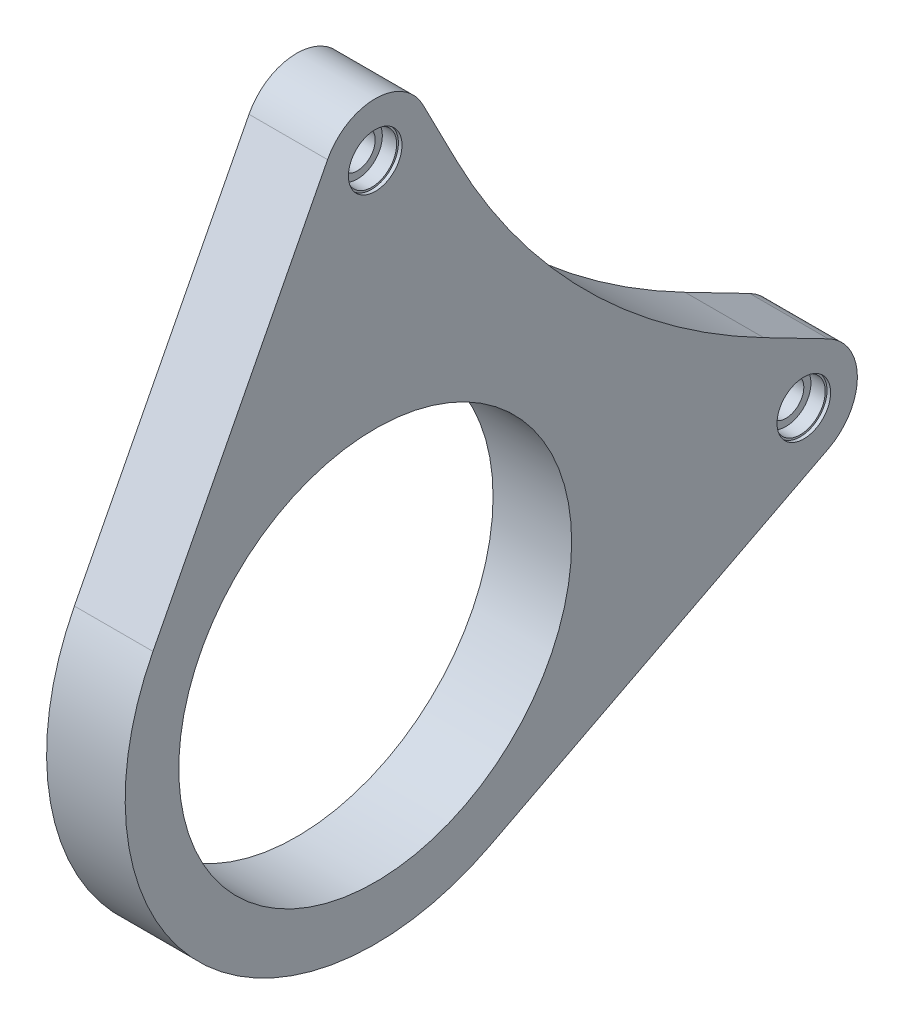
ISO-10303-21;
HEADER;
FILE_DESCRIPTION(('STEP AP214'),'2;1');
FILE_NAME('part.step','',(''),(''),'','','');
FILE_SCHEMA(('AUTOMOTIVE_DESIGN { 1 0 10303 214 1 1 1 1 }'));
ENDSEC;
DATA;
#1=APPLICATION_CONTEXT('core data for automotive mechanical design processes');
#2=APPLICATION_PROTOCOL_DEFINITION('international standard','automotive_design',2000,#1);
#3=PRODUCT_CONTEXT('',#1,'mechanical');
#4=PRODUCT('Part','Part','',(#3));
#5=PRODUCT_RELATED_PRODUCT_CATEGORY('part','',(#4));
#6=PRODUCT_DEFINITION_FORMATION('','',#4);
#7=PRODUCT_DEFINITION_CONTEXT('part definition',#1,'design');
#8=PRODUCT_DEFINITION('design','',#6,#7);
#9=PRODUCT_DEFINITION_SHAPE('','',#8);
#10=(LENGTH_UNIT() NAMED_UNIT(*) SI_UNIT(.MILLI.,.METRE.));
#11=(NAMED_UNIT(*) PLANE_ANGLE_UNIT() SI_UNIT($,.RADIAN.));
#12=(NAMED_UNIT(*) SI_UNIT($,.STERADIAN.) SOLID_ANGLE_UNIT());
#13=UNCERTAINTY_MEASURE_WITH_UNIT(LENGTH_MEASURE(1.E-05),#10,'distance_accuracy_value','');
#14=(GEOMETRIC_REPRESENTATION_CONTEXT(3) GLOBAL_UNCERTAINTY_ASSIGNED_CONTEXT((#13)) GLOBAL_UNIT_ASSIGNED_CONTEXT((#10,
#11,#12)) REPRESENTATION_CONTEXT('',''));
#15=CARTESIAN_POINT('',(0.,0.,0.));
#16=DIRECTION('',(0.,0.,1.));
#17=DIRECTION('',(1.,0.,0.));
#18=AXIS2_PLACEMENT_3D('',#15,#16,#17);
#19=CARTESIAN_POINT('',(11.,-3.46944695195361E-13,-120.));
#20=DIRECTION('',(-1.,0.,0.));
#21=DIRECTION('',(0.,0.,1.));
#22=AXIS2_PLACEMENT_3D('',#19,#20,#21);
#23=CYLINDRICAL_SURFACE('',#22,5.);
#24=CARTESIAN_POINT('',(6.,-3.46944695195361E-13,-120.));
#25=DIRECTION('',(1.,0.,0.));
#26=DIRECTION('',(0.,0.,-1.));
#27=AXIS2_PLACEMENT_3D('',#24,#25,#26);
#28=CIRCLE('',#27,5.);
#29=CARTESIAN_POINT('',(6.,-3.46944695195361E-13,-125.));
#30=VERTEX_POINT('',#29);
#31=EDGE_CURVE('E162',#30,#30,#28,.T.);
#32=ORIENTED_EDGE('',*,*,#31,.T.);
#33=EDGE_LOOP('',(#32));
#34=FACE_BOUND('',#33,.T.);
#35=CARTESIAN_POINT('',(-6.,-3.46944695195361E-13,-120.));
#36=DIRECTION('',(-1.,0.,0.));
#37=DIRECTION('',(0.,0.,1.));
#38=AXIS2_PLACEMENT_3D('',#35,#36,#37);
#39=CIRCLE('',#38,5.);
#40=CARTESIAN_POINT('',(-6.,-3.46944695195361E-13,-115.));
#41=VERTEX_POINT('',#40);
#42=EDGE_CURVE('E168',#41,#41,#39,.T.);
#43=ORIENTED_EDGE('',*,*,#42,.T.);
#44=EDGE_LOOP('',(#43));
#45=FACE_BOUND('',#44,.T.);
#46=ADVANCED_FACE('F45',(#34,#45),#23,.F.);
#47=CARTESIAN_POINT('',(11.,120.,0.));
#48=DIRECTION('',(-1.,0.,0.));
#49=DIRECTION('',(0.,0.,1.));
#50=AXIS2_PLACEMENT_3D('',#47,#48,#49);
#51=CYLINDRICAL_SURFACE('',#50,5.);
#52=CARTESIAN_POINT('',(6.,120.,0.));
#53=DIRECTION('',(1.,0.,0.));
#54=DIRECTION('',(0.,0.,-1.));
#55=AXIS2_PLACEMENT_3D('',#52,#53,#54);
#56=CIRCLE('',#55,5.);
#57=CARTESIAN_POINT('',(6.,120.,-5.));
#58=VERTEX_POINT('',#57);
#59=EDGE_CURVE('E150',#58,#58,#56,.T.);
#60=ORIENTED_EDGE('',*,*,#59,.T.);
#61=EDGE_LOOP('',(#60));
#62=FACE_BOUND('',#61,.T.);
#63=CARTESIAN_POINT('',(-6.,120.,0.));
#64=DIRECTION('',(-1.,0.,0.));
#65=DIRECTION('',(0.,0.,1.));
#66=AXIS2_PLACEMENT_3D('',#63,#64,#65);
#67=CIRCLE('',#66,5.);
#68=CARTESIAN_POINT('',(-6.,120.,5.));
#69=VERTEX_POINT('',#68);
#70=EDGE_CURVE('E156',#69,#69,#67,.T.);
#71=ORIENTED_EDGE('',*,*,#70,.T.);
#72=EDGE_LOOP('',(#71));
#73=FACE_BOUND('',#72,.T.);
#74=ADVANCED_FACE('F324',(#62,#73),#51,.F.);
#75=CARTESIAN_POINT('',(11.,0.,0.));
#76=DIRECTION('',(1.,0.,0.));
#77=DIRECTION('',(0.,0.,-1.));
#78=AXIS2_PLACEMENT_3D('',#75,#76,#77);
#79=PLANE('',#78);
#80=CARTESIAN_POINT('',(11.,-3.99680288865056E-13,-120.));
#81=DIRECTION('',(-1.,0.,0.));
#82=DIRECTION('',(0.,1.,0.));
#83=AXIS2_PLACEMENT_3D('',#80,#81,#82);
#84=CIRCLE('',#83,7.5);
#85=CARTESIAN_POINT('',(11.,7.4999999999996,-120.));
#86=VERTEX_POINT('',#85);
#87=EDGE_CURVE('E204',#86,#86,#84,.T.);
#88=ORIENTED_EDGE('',*,*,#87,.T.);
#89=EDGE_LOOP('',(#88));
#90=FACE_BOUND('',#89,.T.);
#91=CARTESIAN_POINT('',(11.,120.,0.));
#92=DIRECTION('',(1.,0.,0.));
#93=DIRECTION('',(0.,0.,-1.));
#94=AXIS2_PLACEMENT_3D('',#91,#92,#93);
#95=CIRCLE('',#94,7.5);
#96=CARTESIAN_POINT('',(11.,120.,-7.5));
#97=VERTEX_POINT('',#96);
#98=EDGE_CURVE('E154',#97,#97,#95,.T.);
#99=ORIENTED_EDGE('',*,*,#98,.F.);
#100=EDGE_LOOP('',(#99));
#101=FACE_BOUND('',#100,.T.);
#102=CARTESIAN_POINT('',(11.,0.,0.));
#103=DIRECTION('',(1.,0.,0.));
#104=DIRECTION('',(0.,0.,-1.));
#105=AXIS2_PLACEMENT_3D('',#102,#103,#104);
#106=CIRCLE('',#105,70.);
#107=CARTESIAN_POINT('',(11.,32.0833333333333,62.2146262724628));
#108=VERTEX_POINT('',#107);
#109=CARTESIAN_POINT('',(11.,-62.2146262724629,-32.0833333333331));
#110=VERTEX_POINT('',#109);
#111=EDGE_CURVE('E123',#108,#110,#106,.T.);
#112=ORIENTED_EDGE('',*,*,#111,.T.);
#113=DIRECTION('',(0.,0.458333333333331,-0.888780375320899));
#114=VECTOR('',#113,1.);
#115=CARTESIAN_POINT('',(11.,-62.2146262724629,-32.0833333333331));
#116=LINE('',#115,#114);
#117=CARTESIAN_POINT('',(11.,-13.3317056298138,-126.875));
#118=VERTEX_POINT('',#117);
#119=EDGE_CURVE('E111',#110,#118,#116,.T.);
#120=ORIENTED_EDGE('',*,*,#119,.T.);
#121=CARTESIAN_POINT('',(11.,-3.46944695195361E-13,-120.));
#122=DIRECTION('',(1.,0.,0.));
#123=DIRECTION('',(0.,0.,1.));
#124=AXIS2_PLACEMENT_3D('',#121,#122,#123);
#125=CIRCLE('',#124,15.);
#126=CARTESIAN_POINT('',(11.,13.3317056298131,-126.875));
#127=VERTEX_POINT('',#126);
#128=EDGE_CURVE('E122',#118,#127,#125,.T.);
#129=ORIENTED_EDGE('',*,*,#128,.T.);
#130=DIRECTION('',(0.,0.458333333333336,0.888780375320896));
#131=VECTOR('',#130,1.);
#132=CARTESIAN_POINT('',(11.,13.3317056298131,-126.875));
#133=LINE('',#132,#131);
#134=CARTESIAN_POINT('',(11.,22.6724398157784,-108.761848213291));
#135=VERTEX_POINT('',#134);
#136=EDGE_CURVE('E247',#127,#135,#133,.T.);
#137=ORIENTED_EDGE('',*,*,#136,.T.);
#138=CARTESIAN_POINT('',(11.,200.428514879958,-200.428514879958));
#139=DIRECTION('',(1.,0.,0.));
#140=DIRECTION('',(0.,0.,-1.));
#141=AXIS2_PLACEMENT_3D('',#138,#139,#140);
#142=CIRCLE('',#141,200.);
#143=CARTESIAN_POINT('',(11.,108.761848213291,-22.6724398157787));
#144=VERTEX_POINT('',#143);
#145=EDGE_CURVE('E11',#135,#144,#142,.F.);
#146=ORIENTED_EDGE('',*,*,#145,.T.);
#147=DIRECTION('',(0.,0.888780375320898,0.458333333333333));
#148=VECTOR('',#147,1.);
#149=CARTESIAN_POINT('',(11.,126.875,-13.3317056298135));
#150=LINE('',#149,#148);
#151=CARTESIAN_POINT('',(11.,126.875,-13.3317056298135));
#152=VERTEX_POINT('',#151);
#153=EDGE_CURVE('E250',#144,#152,#150,.T.);
#154=ORIENTED_EDGE('',*,*,#153,.T.);
#155=CARTESIAN_POINT('',(11.,120.,0.));
#156=DIRECTION('',(1.,0.,0.));
#157=DIRECTION('',(0.,0.,-1.));
#158=AXIS2_PLACEMENT_3D('',#155,#156,#157);
#159=CIRCLE('',#158,15.);
#160=CARTESIAN_POINT('',(11.,126.875,13.3317056298135));
#161=VERTEX_POINT('',#160);
#162=EDGE_CURVE('E253',#152,#161,#159,.T.);
#163=ORIENTED_EDGE('',*,*,#162,.T.);
#164=DIRECTION('',(0.,-0.888780375320897,0.458333333333333));
#165=VECTOR('',#164,1.);
#166=CARTESIAN_POINT('',(11.,32.0833333333333,62.2146262724628));
#167=LINE('',#166,#165);
#168=EDGE_CURVE('E129',#161,#108,#167,.T.);
#169=ORIENTED_EDGE('',*,*,#168,.T.);
#170=EDGE_LOOP('',(#112,#120,#129,#137,#146,#154,#163,#169));
#171=FACE_BOUND('',#170,.T.);
#172=CARTESIAN_POINT('',(11.,0.,0.));
#173=DIRECTION('',(1.,0.,0.));
#174=DIRECTION('',(0.,0.,-1.));
#175=AXIS2_PLACEMENT_3D('',#172,#173,#174);
#176=CIRCLE('',#175,55.);
#177=CARTESIAN_POINT('',(11.,0.,-55.));
#178=VERTEX_POINT('',#177);
#179=EDGE_CURVE('E238',#178,#178,#176,.T.);
#180=ORIENTED_EDGE('',*,*,#179,.F.);
#181=EDGE_LOOP('',(#180));
#182=FACE_BOUND('',#181,.T.);
#183=ADVANCED_FACE('F126',(#90,#101,#171,#182),#79,.T.);
#184=CARTESIAN_POINT('',(-11.,0.,0.));
#185=DIRECTION('',(1.,0.,0.));
#186=DIRECTION('',(0.,0.,-1.));
#187=AXIS2_PLACEMENT_3D('',#184,#185,#186);
#188=PLANE('',#187);
#189=CARTESIAN_POINT('',(-11.,-3.99680288865056E-13,-120.));
#190=DIRECTION('',(-1.,0.,0.));
#191=DIRECTION('',(0.,1.,0.));
#192=AXIS2_PLACEMENT_3D('',#189,#190,#191);
#193=CIRCLE('',#192,7.5);
#194=CARTESIAN_POINT('',(-11.,7.4999999999996,-120.));
#195=VERTEX_POINT('',#194);
#196=EDGE_CURVE('E160',#195,#195,#193,.T.);
#197=ORIENTED_EDGE('',*,*,#196,.F.);
#198=EDGE_LOOP('',(#197));
#199=FACE_BOUND('',#198,.T.);
#200=CARTESIAN_POINT('',(-11.,120.,0.));
#201=DIRECTION('',(1.,0.,0.));
#202=DIRECTION('',(0.,0.,-1.));
#203=AXIS2_PLACEMENT_3D('',#200,#201,#202);
#204=CIRCLE('',#203,7.5);
#205=CARTESIAN_POINT('',(-11.,120.,-7.5));
#206=VERTEX_POINT('',#205);
#207=EDGE_CURVE('E212',#206,#206,#204,.T.);
#208=ORIENTED_EDGE('',*,*,#207,.T.);
#209=EDGE_LOOP('',(#208));
#210=FACE_BOUND('',#209,.T.);
#211=CARTESIAN_POINT('',(-11.,0.,0.));
#212=DIRECTION('',(1.,0.,0.));
#213=DIRECTION('',(0.,0.,-1.));
#214=AXIS2_PLACEMENT_3D('',#211,#212,#213);
#215=CIRCLE('',#214,70.);
#216=CARTESIAN_POINT('',(-11.,32.0833333333333,62.2146262724628));
#217=VERTEX_POINT('',#216);
#218=CARTESIAN_POINT('',(-11.,-62.2146262724629,-32.0833333333331));
#219=VERTEX_POINT('',#218);
#220=EDGE_CURVE('E138',#217,#219,#215,.T.);
#221=ORIENTED_EDGE('',*,*,#220,.F.);
#222=DIRECTION('',(0.,-0.888780375320897,0.458333333333333));
#223=VECTOR('',#222,1.);
#224=CARTESIAN_POINT('',(-11.,32.0833333333333,62.2146262724628));
#225=LINE('',#224,#223);
#226=CARTESIAN_POINT('',(-11.,126.875,13.3317056298135));
#227=VERTEX_POINT('',#226);
#228=EDGE_CURVE('E134',#227,#217,#225,.T.);
#229=ORIENTED_EDGE('',*,*,#228,.F.);
#230=CARTESIAN_POINT('',(-11.,120.,0.));
#231=DIRECTION('',(1.,0.,0.));
#232=DIRECTION('',(0.,0.,-1.));
#233=AXIS2_PLACEMENT_3D('',#230,#231,#232);
#234=CIRCLE('',#233,15.);
#235=CARTESIAN_POINT('',(-11.,126.875,-13.3317056298135));
#236=VERTEX_POINT('',#235);
#237=EDGE_CURVE('E273',#236,#227,#234,.T.);
#238=ORIENTED_EDGE('',*,*,#237,.F.);
#239=DIRECTION('',(0.,0.888780375320898,0.458333333333333));
#240=VECTOR('',#239,1.);
#241=CARTESIAN_POINT('',(-11.,126.875,-13.3317056298135));
#242=LINE('',#241,#240);
#243=CARTESIAN_POINT('',(-11.,108.761848213291,-22.6724398157787));
#244=VERTEX_POINT('',#243);
#245=EDGE_CURVE('E270',#244,#236,#242,.T.);
#246=ORIENTED_EDGE('',*,*,#245,.F.);
#247=CARTESIAN_POINT('',(-11.,200.428514879958,-200.428514879958));
#248=DIRECTION('',(1.,0.,0.));
#249=DIRECTION('',(0.,0.,-1.));
#250=AXIS2_PLACEMENT_3D('',#247,#248,#249);
#251=CIRCLE('',#250,200.);
#252=CARTESIAN_POINT('',(-11.,22.6724398157784,-108.761848213291));
#253=VERTEX_POINT('',#252);
#254=EDGE_CURVE('E54',#244,#253,#251,.T.);
#255=ORIENTED_EDGE('',*,*,#254,.T.);
#256=DIRECTION('',(0.,0.458333333333336,0.888780375320896));
#257=VECTOR('',#256,1.);
#258=CARTESIAN_POINT('',(-11.,13.3317056298131,-126.875));
#259=LINE('',#258,#257);
#260=CARTESIAN_POINT('',(-11.,13.3317056298131,-126.875));
#261=VERTEX_POINT('',#260);
#262=EDGE_CURVE('E267',#261,#253,#259,.T.);
#263=ORIENTED_EDGE('',*,*,#262,.F.);
#264=CARTESIAN_POINT('',(-11.,-3.46944695195361E-13,-120.));
#265=DIRECTION('',(1.,0.,0.));
#266=DIRECTION('',(0.,0.,1.));
#267=AXIS2_PLACEMENT_3D('',#264,#265,#266);
#268=CIRCLE('',#267,15.);
#269=CARTESIAN_POINT('',(-11.,-13.3317056298138,-126.875));
#270=VERTEX_POINT('',#269);
#271=EDGE_CURVE('E264',#270,#261,#268,.T.);
#272=ORIENTED_EDGE('',*,*,#271,.F.);
#273=DIRECTION('',(0.,0.458333333333331,-0.888780375320899));
#274=VECTOR('',#273,1.);
#275=CARTESIAN_POINT('',(-11.,-62.2146262724629,-32.0833333333331));
#276=LINE('',#275,#274);
#277=EDGE_CURVE('E261',#219,#270,#276,.T.);
#278=ORIENTED_EDGE('',*,*,#277,.F.);
#279=EDGE_LOOP('',(#221,#229,#238,#246,#255,#263,#272,#278));
#280=FACE_BOUND('',#279,.T.);
#281=CARTESIAN_POINT('',(-11.,0.,0.));
#282=DIRECTION('',(1.,0.,0.));
#283=DIRECTION('',(0.,0.,-1.));
#284=AXIS2_PLACEMENT_3D('',#281,#282,#283);
#285=CIRCLE('',#284,55.);
#286=CARTESIAN_POINT('',(-11.,0.,-55.));
#287=VERTEX_POINT('',#286);
#288=EDGE_CURVE('E234',#287,#287,#285,.T.);
#289=ORIENTED_EDGE('',*,*,#288,.T.);
#290=EDGE_LOOP('',(#289));
#291=FACE_BOUND('',#290,.T.);
#292=ADVANCED_FACE('F293',(#199,#210,#280,#291),#188,.F.);
#293=CARTESIAN_POINT('',(11.,0.,0.));
#294=DIRECTION('',(-1.,0.,0.));
#295=DIRECTION('',(0.,0.,1.));
#296=AXIS2_PLACEMENT_3D('',#293,#294,#295);
#297=CYLINDRICAL_SURFACE('',#296,70.);
#298=ORIENTED_EDGE('',*,*,#220,.T.);
#299=DIRECTION('',(-1.,0.,0.));
#300=VECTOR('',#299,1.);
#301=CARTESIAN_POINT('',(11.,-62.2146262724629,-32.0833333333331));
#302=LINE('',#301,#300);
#303=EDGE_CURVE('E115',#110,#219,#302,.T.);
#304=ORIENTED_EDGE('',*,*,#303,.F.);
#305=ORIENTED_EDGE('',*,*,#111,.F.);
#306=DIRECTION('',(-1.,0.,0.));
#307=VECTOR('',#306,1.);
#308=CARTESIAN_POINT('',(11.,32.0833333333333,62.2146262724628));
#309=LINE('',#308,#307);
#310=EDGE_CURVE('E258',#108,#217,#309,.T.);
#311=ORIENTED_EDGE('',*,*,#310,.T.);
#312=EDGE_LOOP('',(#298,#304,#305,#311));
#313=FACE_BOUND('',#312,.T.);
#314=ADVANCED_FACE('F136',(#313),#297,.T.);
#315=CARTESIAN_POINT('',(11.,-62.2146262724629,-32.0833333333331));
#316=DIRECTION('',(0.,0.888780375320899,0.458333333333331));
#317=DIRECTION('',(0.,-0.458333333333331,0.888780375320899));
#318=AXIS2_PLACEMENT_3D('',#315,#316,#317);
#319=PLANE('',#318);
#320=ORIENTED_EDGE('',*,*,#277,.T.);
#321=DIRECTION('',(-1.,0.,0.));
#322=VECTOR('',#321,1.);
#323=CARTESIAN_POINT('',(11.,-13.3317056298138,-126.875));
#324=LINE('',#323,#322);
#325=EDGE_CURVE('E118',#118,#270,#324,.T.);
#326=ORIENTED_EDGE('',*,*,#325,.F.);
#327=ORIENTED_EDGE('',*,*,#119,.F.);
#328=ORIENTED_EDGE('',*,*,#303,.T.);
#329=EDGE_LOOP('',(#320,#326,#327,#328));
#330=FACE_BOUND('',#329,.T.);
#331=ADVANCED_FACE('F113',(#330),#319,.F.);
#332=CARTESIAN_POINT('',(11.,-3.46944695195361E-13,-120.));
#333=DIRECTION('',(-1.,0.,0.));
#334=DIRECTION('',(0.,0.,1.));
#335=AXIS2_PLACEMENT_3D('',#332,#333,#334);
#336=CYLINDRICAL_SURFACE('',#335,15.);
#337=ORIENTED_EDGE('',*,*,#271,.T.);
#338=DIRECTION('',(-1.,0.,0.));
#339=VECTOR('',#338,1.);
#340=CARTESIAN_POINT('',(11.,13.3317056298131,-126.875));
#341=LINE('',#340,#339);
#342=EDGE_CURVE('E146',#127,#261,#341,.T.);
#343=ORIENTED_EDGE('',*,*,#342,.F.);
#344=ORIENTED_EDGE('',*,*,#128,.F.);
#345=ORIENTED_EDGE('',*,*,#325,.T.);
#346=EDGE_LOOP('',(#337,#343,#344,#345));
#347=FACE_BOUND('',#346,.T.);
#348=ADVANCED_FACE('F295',(#347),#336,.T.);
#349=CARTESIAN_POINT('',(11.,13.3317056298131,-126.875));
#350=DIRECTION('',(0.,-0.888780375320896,0.458333333333336));
#351=DIRECTION('',(0.,-0.458333333333336,-0.888780375320896));
#352=AXIS2_PLACEMENT_3D('',#349,#350,#351);
#353=PLANE('',#352);
#354=ORIENTED_EDGE('',*,*,#262,.T.);
#355=DIRECTION('',(-1.,0.,0.));
#356=VECTOR('',#355,1.);
#357=CARTESIAN_POINT('',(11.,22.6724398157784,-108.761848213291));
#358=LINE('',#357,#356);
#359=EDGE_CURVE('E61',#253,#135,#358,.F.);
#360=ORIENTED_EDGE('',*,*,#359,.T.);
#361=ORIENTED_EDGE('',*,*,#136,.F.);
#362=ORIENTED_EDGE('',*,*,#342,.T.);
#363=EDGE_LOOP('',(#354,#360,#361,#362));
#364=FACE_BOUND('',#363,.T.);
#365=ADVANCED_FACE('F290',(#364),#353,.F.);
#366=CARTESIAN_POINT('',(11.,126.875,-13.3317056298135));
#367=DIRECTION('',(0.,-0.458333333333333,0.888780375320898));
#368=DIRECTION('',(0.,-0.888780375320898,-0.458333333333333));
#369=AXIS2_PLACEMENT_3D('',#366,#367,#368);
#370=PLANE('',#369);
#371=ORIENTED_EDGE('',*,*,#153,.F.);
#372=DIRECTION('',(-1.,0.,0.));
#373=VECTOR('',#372,1.);
#374=CARTESIAN_POINT('',(-11.,108.761848213291,-22.6724398157787));
#375=LINE('',#374,#373);
#376=EDGE_CURVE('E140',#144,#244,#375,.T.);
#377=ORIENTED_EDGE('',*,*,#376,.T.);
#378=ORIENTED_EDGE('',*,*,#245,.T.);
#379=DIRECTION('',(-1.,0.,0.));
#380=VECTOR('',#379,1.);
#381=CARTESIAN_POINT('',(11.,126.875,-13.3317056298135));
#382=LINE('',#381,#380);
#383=EDGE_CURVE('E284',#152,#236,#382,.T.);
#384=ORIENTED_EDGE('',*,*,#383,.F.);
#385=EDGE_LOOP('',(#371,#377,#378,#384));
#386=FACE_BOUND('',#385,.T.);
#387=ADVANCED_FACE('F301',(#386),#370,.F.);
#388=CARTESIAN_POINT('',(11.,120.,0.));
#389=DIRECTION('',(-1.,0.,0.));
#390=DIRECTION('',(0.,0.,1.));
#391=AXIS2_PLACEMENT_3D('',#388,#389,#390);
#392=CYLINDRICAL_SURFACE('',#391,15.);
#393=ORIENTED_EDGE('',*,*,#237,.T.);
#394=DIRECTION('',(-1.,0.,0.));
#395=VECTOR('',#394,1.);
#396=CARTESIAN_POINT('',(11.,126.875,13.3317056298135));
#397=LINE('',#396,#395);
#398=EDGE_CURVE('E280',#161,#227,#397,.T.);
#399=ORIENTED_EDGE('',*,*,#398,.F.);
#400=ORIENTED_EDGE('',*,*,#162,.F.);
#401=ORIENTED_EDGE('',*,*,#383,.T.);
#402=EDGE_LOOP('',(#393,#399,#400,#401));
#403=FACE_BOUND('',#402,.T.);
#404=ADVANCED_FACE('F307',(#403),#392,.T.);
#405=CARTESIAN_POINT('',(11.,32.0833333333333,62.2146262724628));
#406=DIRECTION('',(0.,-0.458333333333334,-0.888780375320898));
#407=DIRECTION('',(0.,0.888780375320898,-0.458333333333334));
#408=AXIS2_PLACEMENT_3D('',#405,#406,#407);
#409=PLANE('',#408);
#410=ORIENTED_EDGE('',*,*,#228,.T.);
#411=ORIENTED_EDGE('',*,*,#310,.F.);
#412=ORIENTED_EDGE('',*,*,#168,.F.);
#413=ORIENTED_EDGE('',*,*,#398,.T.);
#414=EDGE_LOOP('',(#410,#411,#412,#413));
#415=FACE_BOUND('',#414,.T.);
#416=ADVANCED_FACE('F310',(#415),#409,.F.);
#417=CARTESIAN_POINT('',(11.,0.,0.));
#418=DIRECTION('',(-1.,0.,0.));
#419=DIRECTION('',(0.,0.,1.));
#420=AXIS2_PLACEMENT_3D('',#417,#418,#419);
#421=CYLINDRICAL_SURFACE('',#420,55.);
#422=ORIENTED_EDGE('',*,*,#179,.T.);
#423=EDGE_LOOP('',(#422));
#424=FACE_BOUND('',#423,.T.);
#425=ORIENTED_EDGE('',*,*,#288,.F.);
#426=EDGE_LOOP('',(#425));
#427=FACE_BOUND('',#426,.T.);
#428=ADVANCED_FACE('F312',(#424,#427),#421,.F.);
#429=CARTESIAN_POINT('',(10.,120.,0.));
#430=DIRECTION('',(1.,0.,0.));
#431=DIRECTION('',(0.,0.,-1.));
#432=AXIS2_PLACEMENT_3D('',#429,#430,#431);
#433=CYLINDRICAL_SURFACE('',#432,7.5);
#434=CARTESIAN_POINT('',(10.,120.,0.));
#435=DIRECTION('',(1.,0.,0.));
#436=DIRECTION('',(0.,0.,-1.));
#437=AXIS2_PLACEMENT_3D('',#434,#435,#436);
#438=CIRCLE('',#437,7.5);
#439=CARTESIAN_POINT('',(10.,120.,-7.5));
#440=VERTEX_POINT('',#439);
#441=EDGE_CURVE('E230',#440,#440,#438,.T.);
#442=ORIENTED_EDGE('',*,*,#441,.F.);
#443=EDGE_LOOP('',(#442));
#444=FACE_BOUND('',#443,.T.);
#445=ORIENTED_EDGE('',*,*,#98,.T.);
#446=EDGE_LOOP('',(#445));
#447=FACE_BOUND('',#446,.T.);
#448=ADVANCED_FACE('F318',(#444,#447),#433,.F.);
#449=CARTESIAN_POINT('',(10.,120.,0.));
#450=DIRECTION('',(1.,0.,0.));
#451=DIRECTION('',(0.,0.,-1.));
#452=AXIS2_PLACEMENT_3D('',#449,#450,#451);
#453=PLANE('',#452);
#454=CARTESIAN_POINT('',(10.,120.,0.));
#455=DIRECTION('',(1.,0.,0.));
#456=DIRECTION('',(0.,0.,-1.));
#457=AXIS2_PLACEMENT_3D('',#454,#455,#456);
#458=CIRCLE('',#457,7.);
#459=CARTESIAN_POINT('',(10.,120.,-7.));
#460=VERTEX_POINT('',#459);
#461=EDGE_CURVE('E220',#460,#460,#458,.T.);
#462=ORIENTED_EDGE('',*,*,#461,.F.);
#463=EDGE_LOOP('',(#462));
#464=FACE_BOUND('',#463,.T.);
#465=ORIENTED_EDGE('',*,*,#441,.T.);
#466=EDGE_LOOP('',(#465));
#467=FACE_BOUND('',#466,.T.);
#468=ADVANCED_FACE('F366',(#464,#467),#453,.T.);
#469=CARTESIAN_POINT('',(6.,120.,0.));
#470=DIRECTION('',(1.,0.,0.));
#471=DIRECTION('',(0.,0.,-1.));
#472=AXIS2_PLACEMENT_3D('',#469,#470,#471);
#473=CYLINDRICAL_SURFACE('',#472,7.);
#474=CARTESIAN_POINT('',(6.,120.,0.));
#475=DIRECTION('',(1.,0.,0.));
#476=DIRECTION('',(0.,0.,-1.));
#477=AXIS2_PLACEMENT_3D('',#474,#475,#476);
#478=CIRCLE('',#477,7.);
#479=CARTESIAN_POINT('',(6.,120.,-7.));
#480=VERTEX_POINT('',#479);
#481=EDGE_CURVE('E155',#480,#480,#478,.T.);
#482=ORIENTED_EDGE('',*,*,#481,.F.);
#483=EDGE_LOOP('',(#482));
#484=FACE_BOUND('',#483,.T.);
#485=ORIENTED_EDGE('',*,*,#461,.T.);
#486=EDGE_LOOP('',(#485));
#487=FACE_BOUND('',#486,.T.);
#488=ADVANCED_FACE('F360',(#484,#487),#473,.F.);
#489=CARTESIAN_POINT('',(6.,120.,0.));
#490=DIRECTION('',(1.,0.,0.));
#491=DIRECTION('',(0.,0.,-1.));
#492=AXIS2_PLACEMENT_3D('',#489,#490,#491);
#493=PLANE('',#492);
#494=ORIENTED_EDGE('',*,*,#59,.F.);
#495=EDGE_LOOP('',(#494));
#496=FACE_BOUND('',#495,.T.);
#497=ORIENTED_EDGE('',*,*,#481,.T.);
#498=EDGE_LOOP('',(#497));
#499=FACE_BOUND('',#498,.T.);
#500=ADVANCED_FACE('F351',(#496,#499),#493,.T.);
#501=CARTESIAN_POINT('',(-10.,120.,0.));
#502=DIRECTION('',(-1.,0.,0.));
#503=DIRECTION('',(0.,0.,1.));
#504=AXIS2_PLACEMENT_3D('',#501,#502,#503);
#505=CYLINDRICAL_SURFACE('',#504,7.5);
#506=CARTESIAN_POINT('',(-10.,120.,0.));
#507=DIRECTION('',(1.,0.,0.));
#508=DIRECTION('',(0.,0.,-1.));
#509=AXIS2_PLACEMENT_3D('',#506,#507,#508);
#510=CIRCLE('',#509,7.5);
#511=CARTESIAN_POINT('',(-10.,120.,-7.5));
#512=VERTEX_POINT('',#511);
#513=EDGE_CURVE('E216',#512,#512,#510,.T.);
#514=ORIENTED_EDGE('',*,*,#513,.T.);
#515=EDGE_LOOP('',(#514));
#516=FACE_BOUND('',#515,.T.);
#517=ORIENTED_EDGE('',*,*,#207,.F.);
#518=EDGE_LOOP('',(#517));
#519=FACE_BOUND('',#518,.T.);
#520=ADVANCED_FACE('F348',(#516,#519),#505,.F.);
#521=CARTESIAN_POINT('',(-10.,120.,0.));
#522=DIRECTION('',(-1.,0.,0.));
#523=DIRECTION('',(0.,0.,-1.));
#524=AXIS2_PLACEMENT_3D('',#521,#522,#523);
#525=PLANE('',#524);
#526=CARTESIAN_POINT('',(-10.,120.,0.));
#527=DIRECTION('',(1.,0.,0.));
#528=DIRECTION('',(0.,0.,-1.));
#529=AXIS2_PLACEMENT_3D('',#526,#527,#528);
#530=CIRCLE('',#529,7.);
#531=CARTESIAN_POINT('',(-10.,120.,-7.));
#532=VERTEX_POINT('',#531);
#533=EDGE_CURVE('E166',#532,#532,#530,.T.);
#534=ORIENTED_EDGE('',*,*,#533,.T.);
#535=EDGE_LOOP('',(#534));
#536=FACE_BOUND('',#535,.T.);
#537=ORIENTED_EDGE('',*,*,#513,.F.);
#538=EDGE_LOOP('',(#537));
#539=FACE_BOUND('',#538,.T.);
#540=ADVANCED_FACE('F350',(#536,#539),#525,.T.);
#541=CARTESIAN_POINT('',(10.,-3.99680288865056E-13,-120.));
#542=DIRECTION('',(1.,0.,0.));
#543=DIRECTION('',(0.,0.,-1.));
#544=AXIS2_PLACEMENT_3D('',#541,#542,#543);
#545=CYLINDRICAL_SURFACE('',#544,7.5);
#546=CARTESIAN_POINT('',(10.,-3.99680288865056E-13,-120.));
#547=DIRECTION('',(-1.,0.,0.));
#548=DIRECTION('',(0.,1.,0.));
#549=AXIS2_PLACEMENT_3D('',#546,#547,#548);
#550=CIRCLE('',#549,7.5);
#551=CARTESIAN_POINT('',(10.,7.4999999999996,-120.));
#552=VERTEX_POINT('',#551);
#553=EDGE_CURVE('E208',#552,#552,#550,.T.);
#554=ORIENTED_EDGE('',*,*,#553,.T.);
#555=EDGE_LOOP('',(#554));
#556=FACE_BOUND('',#555,.T.);
#557=ORIENTED_EDGE('',*,*,#87,.F.);
#558=EDGE_LOOP('',(#557));
#559=FACE_BOUND('',#558,.T.);
#560=ADVANCED_FACE('F357',(#556,#559),#545,.F.);
#561=CARTESIAN_POINT('',(10.,-3.99680288865056E-13,-120.));
#562=DIRECTION('',(1.,0.,0.));
#563=DIRECTION('',(0.,1.,0.));
#564=AXIS2_PLACEMENT_3D('',#561,#562,#563);
#565=PLANE('',#564);
#566=CARTESIAN_POINT('',(10.,-3.99680288865056E-13,-120.));
#567=DIRECTION('',(-1.,0.,0.));
#568=DIRECTION('',(0.,1.,0.));
#569=AXIS2_PLACEMENT_3D('',#566,#567,#568);
#570=CIRCLE('',#569,7.);
#571=CARTESIAN_POINT('',(10.,6.9999999999996,-120.));
#572=VERTEX_POINT('',#571);
#573=EDGE_CURVE('E171',#572,#572,#570,.T.);
#574=ORIENTED_EDGE('',*,*,#573,.T.);
#575=EDGE_LOOP('',(#574));
#576=FACE_BOUND('',#575,.T.);
#577=ORIENTED_EDGE('',*,*,#553,.F.);
#578=EDGE_LOOP('',(#577));
#579=FACE_BOUND('',#578,.T.);
#580=ADVANCED_FACE('F520',(#576,#579),#565,.T.);
#581=CARTESIAN_POINT('',(-10.,-3.99680288865056E-13,-120.));
#582=DIRECTION('',(-1.,0.,0.));
#583=DIRECTION('',(0.,0.,1.));
#584=AXIS2_PLACEMENT_3D('',#581,#582,#583);
#585=CYLINDRICAL_SURFACE('',#584,7.5);
#586=CARTESIAN_POINT('',(-10.,-3.99680288865056E-13,-120.));
#587=DIRECTION('',(-1.,0.,0.));
#588=DIRECTION('',(0.,1.,0.));
#589=AXIS2_PLACEMENT_3D('',#586,#587,#588);
#590=CIRCLE('',#589,7.5);
#591=CARTESIAN_POINT('',(-10.,7.4999999999996,-120.));
#592=VERTEX_POINT('',#591);
#593=EDGE_CURVE('E200',#592,#592,#590,.T.);
#594=ORIENTED_EDGE('',*,*,#593,.F.);
#595=EDGE_LOOP('',(#594));
#596=FACE_BOUND('',#595,.T.);
#597=ORIENTED_EDGE('',*,*,#196,.T.);
#598=EDGE_LOOP('',(#597));
#599=FACE_BOUND('',#598,.T.);
#600=ADVANCED_FACE('F510',(#596,#599),#585,.F.);
#601=CARTESIAN_POINT('',(-10.,-3.99680288865056E-13,-120.));
#602=DIRECTION('',(-1.,0.,0.));
#603=DIRECTION('',(0.,1.,0.));
#604=AXIS2_PLACEMENT_3D('',#601,#602,#603);
#605=PLANE('',#604);
#606=CARTESIAN_POINT('',(-10.,-3.99680288865056E-13,-120.));
#607=DIRECTION('',(-1.,0.,0.));
#608=DIRECTION('',(0.,1.,0.));
#609=AXIS2_PLACEMENT_3D('',#606,#607,#608);
#610=CIRCLE('',#609,7.);
#611=CARTESIAN_POINT('',(-10.,6.9999999999996,-120.));
#612=VERTEX_POINT('',#611);
#613=EDGE_CURVE('E183',#612,#612,#610,.T.);
#614=ORIENTED_EDGE('',*,*,#613,.F.);
#615=EDGE_LOOP('',(#614));
#616=FACE_BOUND('',#615,.T.);
#617=ORIENTED_EDGE('',*,*,#593,.T.);
#618=EDGE_LOOP('',(#617));
#619=FACE_BOUND('',#618,.T.);
#620=ADVANCED_FACE('F501',(#616,#619),#605,.T.);
#621=CARTESIAN_POINT('',(-6.,120.,0.));
#622=DIRECTION('',(-1.,0.,0.));
#623=DIRECTION('',(0.,0.,1.));
#624=AXIS2_PLACEMENT_3D('',#621,#622,#623);
#625=CYLINDRICAL_SURFACE('',#624,7.);
#626=CARTESIAN_POINT('',(-6.,120.,0.));
#627=DIRECTION('',(1.,0.,0.));
#628=DIRECTION('',(0.,0.,-1.));
#629=AXIS2_PLACEMENT_3D('',#626,#627,#628);
#630=CIRCLE('',#629,7.);
#631=CARTESIAN_POINT('',(-6.,120.,-7.));
#632=VERTEX_POINT('',#631);
#633=EDGE_CURVE('E161',#632,#632,#630,.T.);
#634=ORIENTED_EDGE('',*,*,#633,.T.);
#635=EDGE_LOOP('',(#634));
#636=FACE_BOUND('',#635,.T.);
#637=ORIENTED_EDGE('',*,*,#533,.F.);
#638=EDGE_LOOP('',(#637));
#639=FACE_BOUND('',#638,.T.);
#640=ADVANCED_FACE('F492',(#636,#639),#625,.F.);
#641=CARTESIAN_POINT('',(-6.,120.,0.));
#642=DIRECTION('',(-1.,0.,0.));
#643=DIRECTION('',(0.,0.,-1.));
#644=AXIS2_PLACEMENT_3D('',#641,#642,#643);
#645=PLANE('',#644);
#646=ORIENTED_EDGE('',*,*,#70,.F.);
#647=EDGE_LOOP('',(#646));
#648=FACE_BOUND('',#647,.T.);
#649=ORIENTED_EDGE('',*,*,#633,.F.);
#650=EDGE_LOOP('',(#649));
#651=FACE_BOUND('',#650,.T.);
#652=ADVANCED_FACE('F483',(#648,#651),#645,.T.);
#653=CARTESIAN_POINT('',(6.,-3.99680288865056E-13,-120.));
#654=DIRECTION('',(1.,0.,0.));
#655=DIRECTION('',(0.,0.,-1.));
#656=AXIS2_PLACEMENT_3D('',#653,#654,#655);
#657=CYLINDRICAL_SURFACE('',#656,7.);
#658=CARTESIAN_POINT('',(6.,-3.99680288865056E-13,-120.));
#659=DIRECTION('',(-1.,0.,0.));
#660=DIRECTION('',(0.,1.,0.));
#661=AXIS2_PLACEMENT_3D('',#658,#659,#660);
#662=CIRCLE('',#661,7.);
#663=CARTESIAN_POINT('',(6.,6.9999999999996,-120.));
#664=VERTEX_POINT('',#663);
#665=EDGE_CURVE('E167',#664,#664,#662,.T.);
#666=ORIENTED_EDGE('',*,*,#665,.T.);
#667=EDGE_LOOP('',(#666));
#668=FACE_BOUND('',#667,.T.);
#669=ORIENTED_EDGE('',*,*,#573,.F.);
#670=EDGE_LOOP('',(#669));
#671=FACE_BOUND('',#670,.T.);
#672=ADVANCED_FACE('F474',(#668,#671),#657,.F.);
#673=CARTESIAN_POINT('',(6.,-3.99680288865056E-13,-120.));
#674=DIRECTION('',(1.,0.,0.));
#675=DIRECTION('',(0.,1.,0.));
#676=AXIS2_PLACEMENT_3D('',#673,#674,#675);
#677=PLANE('',#676);
#678=ORIENTED_EDGE('',*,*,#31,.F.);
#679=EDGE_LOOP('',(#678));
#680=FACE_BOUND('',#679,.T.);
#681=ORIENTED_EDGE('',*,*,#665,.F.);
#682=EDGE_LOOP('',(#681));
#683=FACE_BOUND('',#682,.T.);
#684=ADVANCED_FACE('F465',(#680,#683),#677,.T.);
#685=CARTESIAN_POINT('',(-6.,-3.99680288865056E-13,-120.));
#686=DIRECTION('',(-1.,0.,0.));
#687=DIRECTION('',(0.,0.,1.));
#688=AXIS2_PLACEMENT_3D('',#685,#686,#687);
#689=CYLINDRICAL_SURFACE('',#688,7.);
#690=CARTESIAN_POINT('',(-6.,-3.99680288865056E-13,-120.));
#691=DIRECTION('',(-1.,0.,0.));
#692=DIRECTION('',(0.,1.,0.));
#693=AXIS2_PLACEMENT_3D('',#690,#691,#692);
#694=CIRCLE('',#693,7.);
#695=CARTESIAN_POINT('',(-6.,6.9999999999996,-120.));
#696=VERTEX_POINT('',#695);
#697=EDGE_CURVE('E172',#696,#696,#694,.T.);
#698=ORIENTED_EDGE('',*,*,#697,.F.);
#699=EDGE_LOOP('',(#698));
#700=FACE_BOUND('',#699,.T.);
#701=ORIENTED_EDGE('',*,*,#613,.T.);
#702=EDGE_LOOP('',(#701));
#703=FACE_BOUND('',#702,.T.);
#704=ADVANCED_FACE('F455',(#700,#703),#689,.F.);
#705=CARTESIAN_POINT('',(-6.,-3.99680288865056E-13,-120.));
#706=DIRECTION('',(-1.,0.,0.));
#707=DIRECTION('',(0.,1.,0.));
#708=AXIS2_PLACEMENT_3D('',#705,#706,#707);
#709=PLANE('',#708);
#710=ORIENTED_EDGE('',*,*,#42,.F.);
#711=EDGE_LOOP('',(#710));
#712=FACE_BOUND('',#711,.T.);
#713=ORIENTED_EDGE('',*,*,#697,.T.);
#714=EDGE_LOOP('',(#713));
#715=FACE_BOUND('',#714,.T.);
#716=ADVANCED_FACE('F451',(#712,#715),#709,.T.);
#717=CARTESIAN_POINT('',(11.,200.428514879958,-200.428514879958));
#718=DIRECTION('',(1.,0.,0.));
#719=DIRECTION('',(0.,0.,-1.));
#720=AXIS2_PLACEMENT_3D('',#717,#718,#719);
#721=CYLINDRICAL_SURFACE('',#720,200.);
#722=ORIENTED_EDGE('',*,*,#145,.F.);
#723=ORIENTED_EDGE('',*,*,#359,.F.);
#724=ORIENTED_EDGE('',*,*,#254,.F.);
#725=ORIENTED_EDGE('',*,*,#376,.F.);
#726=EDGE_LOOP('',(#722,#723,#724,#725));
#727=FACE_BOUND('',#726,.T.);
#728=ADVANCED_FACE('F47',(#727),#721,.F.);
#729=CLOSED_SHELL('',(#46,#74,#183,#292,#314,#331,#348,#365,#387,#404,#416,#428,#448,#468,#488,
#500,#520,#540,#560,#580,#600,#620,#640,#652,#672,#684,#704,#716,#728));
#730=MANIFOLD_SOLID_BREP('B2',#729);
#731=ADVANCED_BREP_SHAPE_REPRESENTATION('',(#18,#730),#14);
#732=SHAPE_DEFINITION_REPRESENTATION(#9,#731);
ENDSEC;
END-ISO-10303-21;
